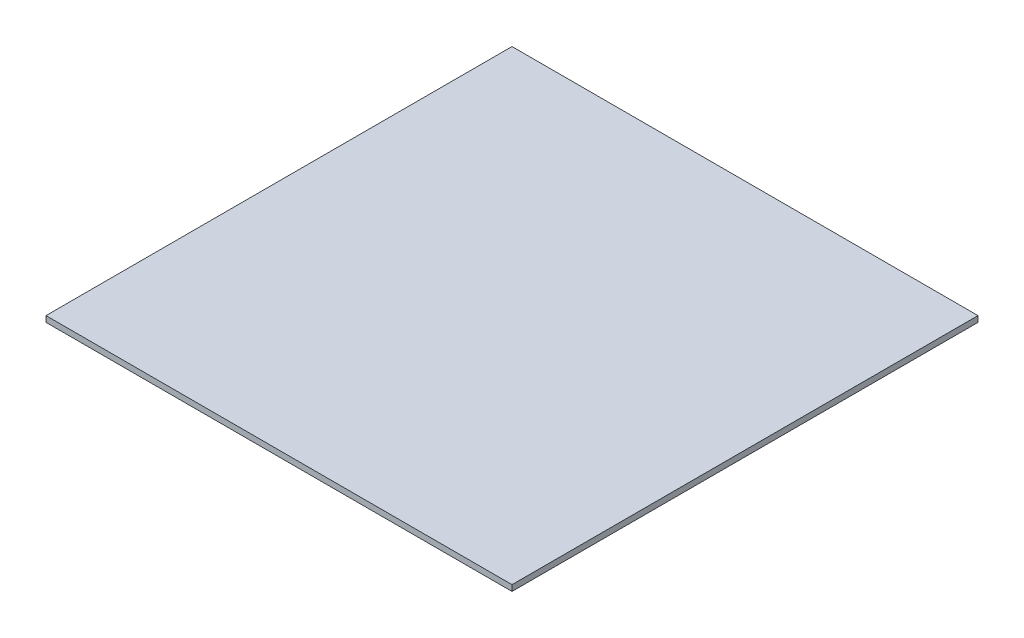
ISO-10303-21;
HEADER;
FILE_DESCRIPTION(('STEP AP214'),'2;1');
FILE_NAME('part.step','',(''),(''),'','','');
FILE_SCHEMA(('AUTOMOTIVE_DESIGN { 1 0 10303 214 1 1 1 1 }'));
ENDSEC;
DATA;
#1=APPLICATION_CONTEXT('core data for automotive mechanical design processes');
#2=APPLICATION_PROTOCOL_DEFINITION('international standard','automotive_design',2000,#1);
#3=PRODUCT_CONTEXT('',#1,'mechanical');
#4=PRODUCT('Part','Part','',(#3));
#5=PRODUCT_RELATED_PRODUCT_CATEGORY('part','',(#4));
#6=PRODUCT_DEFINITION_FORMATION('','',#4);
#7=PRODUCT_DEFINITION_CONTEXT('part definition',#1,'design');
#8=PRODUCT_DEFINITION('design','',#6,#7);
#9=PRODUCT_DEFINITION_SHAPE('','',#8);
#10=(LENGTH_UNIT() NAMED_UNIT(*) SI_UNIT(.MILLI.,.METRE.));
#11=(NAMED_UNIT(*) PLANE_ANGLE_UNIT() SI_UNIT($,.RADIAN.));
#12=(NAMED_UNIT(*) SI_UNIT($,.STERADIAN.) SOLID_ANGLE_UNIT());
#13=UNCERTAINTY_MEASURE_WITH_UNIT(LENGTH_MEASURE(1.E-05),#10,'distance_accuracy_value','');
#14=(GEOMETRIC_REPRESENTATION_CONTEXT(3) GLOBAL_UNCERTAINTY_ASSIGNED_CONTEXT((#13)) GLOBAL_UNIT_ASSIGNED_CONTEXT((#10,
#11,#12)) REPRESENTATION_CONTEXT('',''));
#15=CARTESIAN_POINT('',(0.,0.,0.));
#16=DIRECTION('',(0.,0.,1.));
#17=DIRECTION('',(1.,0.,0.));
#18=AXIS2_PLACEMENT_3D('',#15,#16,#17);
#19=CARTESIAN_POINT('',(0.,6.,0.));
#20=DIRECTION('',(-1.,0.,0.));
#21=DIRECTION('',(0.,0.,1.));
#22=AXIS2_PLACEMENT_3D('',#19,#20,#21);
#23=PLANE('',#22);
#24=DIRECTION('',(0.,0.,-1.));
#25=VECTOR('',#24,1.);
#26=CARTESIAN_POINT('',(0.,0.,0.));
#27=LINE('',#26,#25);
#28=CARTESIAN_POINT('',(0.,0.,0.));
#29=VERTEX_POINT('',#28);
#30=CARTESIAN_POINT('',(0.,0.,-473.));
#31=VERTEX_POINT('',#30);
#32=EDGE_CURVE('E95',#29,#31,#27,.T.);
#33=ORIENTED_EDGE('',*,*,#32,.T.);
#34=DIRECTION('',(0.,-1.,0.));
#35=VECTOR('',#34,1.);
#36=CARTESIAN_POINT('',(0.,6.,-473.));
#37=LINE('',#36,#35);
#38=CARTESIAN_POINT('',(0.,6.,-473.));
#39=VERTEX_POINT('',#38);
#40=EDGE_CURVE('E11',#39,#31,#37,.T.);
#41=ORIENTED_EDGE('',*,*,#40,.F.);
#42=DIRECTION('',(0.,0.,-1.));
#43=VECTOR('',#42,1.);
#44=CARTESIAN_POINT('',(0.,6.,0.));
#45=LINE('',#44,#43);
#46=CARTESIAN_POINT('',(0.,6.,0.));
#47=VERTEX_POINT('',#46);
#48=EDGE_CURVE('E83',#47,#39,#45,.T.);
#49=ORIENTED_EDGE('',*,*,#48,.F.);
#50=DIRECTION('',(0.,-1.,0.));
#51=VECTOR('',#50,1.);
#52=CARTESIAN_POINT('',(0.,6.,0.));
#53=LINE('',#52,#51);
#54=EDGE_CURVE('E91',#47,#29,#53,.T.);
#55=ORIENTED_EDGE('',*,*,#54,.T.);
#56=EDGE_LOOP('',(#33,#41,#49,#55));
#57=FACE_BOUND('',#56,.T.);
#58=ADVANCED_FACE('F32',(#57),#23,.F.);
#59=CARTESIAN_POINT('',(0.,6.,-473.));
#60=DIRECTION('',(0.,0.,1.));
#61=DIRECTION('',(1.,0.,0.));
#62=AXIS2_PLACEMENT_3D('',#59,#60,#61);
#63=PLANE('',#62);
#64=DIRECTION('',(-1.,0.,0.));
#65=VECTOR('',#64,1.);
#66=CARTESIAN_POINT('',(0.,0.,-473.));
#67=LINE('',#66,#65);
#68=CARTESIAN_POINT('',(-473.,0.,-473.));
#69=VERTEX_POINT('',#68);
#70=EDGE_CURVE('E87',#31,#69,#67,.T.);
#71=ORIENTED_EDGE('',*,*,#70,.T.);
#72=DIRECTION('',(0.,-1.,0.));
#73=VECTOR('',#72,1.);
#74=CARTESIAN_POINT('',(-473.,6.,-473.));
#75=LINE('',#74,#73);
#76=CARTESIAN_POINT('',(-473.,6.,-473.));
#77=VERTEX_POINT('',#76);
#78=EDGE_CURVE('E40',#77,#69,#75,.T.);
#79=ORIENTED_EDGE('',*,*,#78,.F.);
#80=DIRECTION('',(-1.,0.,0.));
#81=VECTOR('',#80,1.);
#82=CARTESIAN_POINT('',(0.,6.,-473.));
#83=LINE('',#82,#81);
#84=EDGE_CURVE('E78',#39,#77,#83,.T.);
#85=ORIENTED_EDGE('',*,*,#84,.F.);
#86=ORIENTED_EDGE('',*,*,#40,.T.);
#87=EDGE_LOOP('',(#71,#79,#85,#86));
#88=FACE_BOUND('',#87,.T.);
#89=ADVANCED_FACE('F86',(#88),#63,.F.);
#90=CARTESIAN_POINT('',(-473.,6.,0.));
#91=DIRECTION('',(1.,0.,0.));
#92=DIRECTION('',(0.,0.,-1.));
#93=AXIS2_PLACEMENT_3D('',#90,#91,#92);
#94=PLANE('',#93);
#95=DIRECTION('',(0.,0.,1.));
#96=VECTOR('',#95,1.);
#97=CARTESIAN_POINT('',(-473.,0.,0.));
#98=LINE('',#97,#96);
#99=CARTESIAN_POINT('',(-473.,0.,0.));
#100=VERTEX_POINT('',#99);
#101=EDGE_CURVE('E65',#69,#100,#98,.T.);
#102=ORIENTED_EDGE('',*,*,#101,.T.);
#103=DIRECTION('',(0.,-1.,0.));
#104=VECTOR('',#103,1.);
#105=CARTESIAN_POINT('',(-473.,6.,0.));
#106=LINE('',#105,#104);
#107=CARTESIAN_POINT('',(-473.,6.,0.));
#108=VERTEX_POINT('',#107);
#109=EDGE_CURVE('E88',#108,#100,#106,.T.);
#110=ORIENTED_EDGE('',*,*,#109,.F.);
#111=DIRECTION('',(0.,0.,1.));
#112=VECTOR('',#111,1.);
#113=CARTESIAN_POINT('',(-473.,6.,0.));
#114=LINE('',#113,#112);
#115=EDGE_CURVE('E81',#77,#108,#114,.T.);
#116=ORIENTED_EDGE('',*,*,#115,.F.);
#117=ORIENTED_EDGE('',*,*,#78,.T.);
#118=EDGE_LOOP('',(#102,#110,#116,#117));
#119=FACE_BOUND('',#118,.T.);
#120=ADVANCED_FACE('F89',(#119),#94,.F.);
#121=CARTESIAN_POINT('',(0.,6.,0.));
#122=DIRECTION('',(0.,0.,-1.));
#123=DIRECTION('',(-1.,0.,0.));
#124=AXIS2_PLACEMENT_3D('',#121,#122,#123);
#125=PLANE('',#124);
#126=DIRECTION('',(1.,0.,0.));
#127=VECTOR('',#126,1.);
#128=CARTESIAN_POINT('',(0.,0.,0.));
#129=LINE('',#128,#127);
#130=EDGE_CURVE('E71',#100,#29,#129,.T.);
#131=ORIENTED_EDGE('',*,*,#130,.T.);
#132=ORIENTED_EDGE('',*,*,#54,.F.);
#133=DIRECTION('',(1.,0.,0.));
#134=VECTOR('',#133,1.);
#135=CARTESIAN_POINT('',(0.,6.,0.));
#136=LINE('',#135,#134);
#137=EDGE_CURVE('E48',#108,#47,#136,.T.);
#138=ORIENTED_EDGE('',*,*,#137,.F.);
#139=ORIENTED_EDGE('',*,*,#109,.T.);
#140=EDGE_LOOP('',(#131,#132,#138,#139));
#141=FACE_BOUND('',#140,.T.);
#142=ADVANCED_FACE('F102',(#141),#125,.F.);
#143=CARTESIAN_POINT('',(0.,6.,0.));
#144=DIRECTION('',(0.,1.,0.));
#145=DIRECTION('',(0.,0.,1.));
#146=AXIS2_PLACEMENT_3D('',#143,#144,#145);
#147=PLANE('',#146);
#148=ORIENTED_EDGE('',*,*,#48,.T.);
#149=ORIENTED_EDGE('',*,*,#84,.T.);
#150=ORIENTED_EDGE('',*,*,#115,.T.);
#151=ORIENTED_EDGE('',*,*,#137,.T.);
#152=EDGE_LOOP('',(#148,#149,#150,#151));
#153=FACE_BOUND('',#152,.T.);
#154=ADVANCED_FACE('F79',(#153),#147,.T.);
#155=CARTESIAN_POINT('',(0.,0.,0.));
#156=DIRECTION('',(0.,1.,0.));
#157=DIRECTION('',(0.,0.,1.));
#158=AXIS2_PLACEMENT_3D('',#155,#156,#157);
#159=PLANE('',#158);
#160=ORIENTED_EDGE('',*,*,#32,.F.);
#161=ORIENTED_EDGE('',*,*,#130,.F.);
#162=ORIENTED_EDGE('',*,*,#101,.F.);
#163=ORIENTED_EDGE('',*,*,#70,.F.);
#164=EDGE_LOOP('',(#160,#161,#162,#163));
#165=FACE_BOUND('',#164,.T.);
#166=ADVANCED_FACE('F105',(#165),#159,.F.);
#167=CLOSED_SHELL('',(#58,#89,#120,#142,#154,#166));
#168=MANIFOLD_SOLID_BREP('B2',#167);
#169=ADVANCED_BREP_SHAPE_REPRESENTATION('',(#18,#168),#14);
#170=SHAPE_DEFINITION_REPRESENTATION(#9,#169);
ENDSEC;
END-ISO-10303-21;
